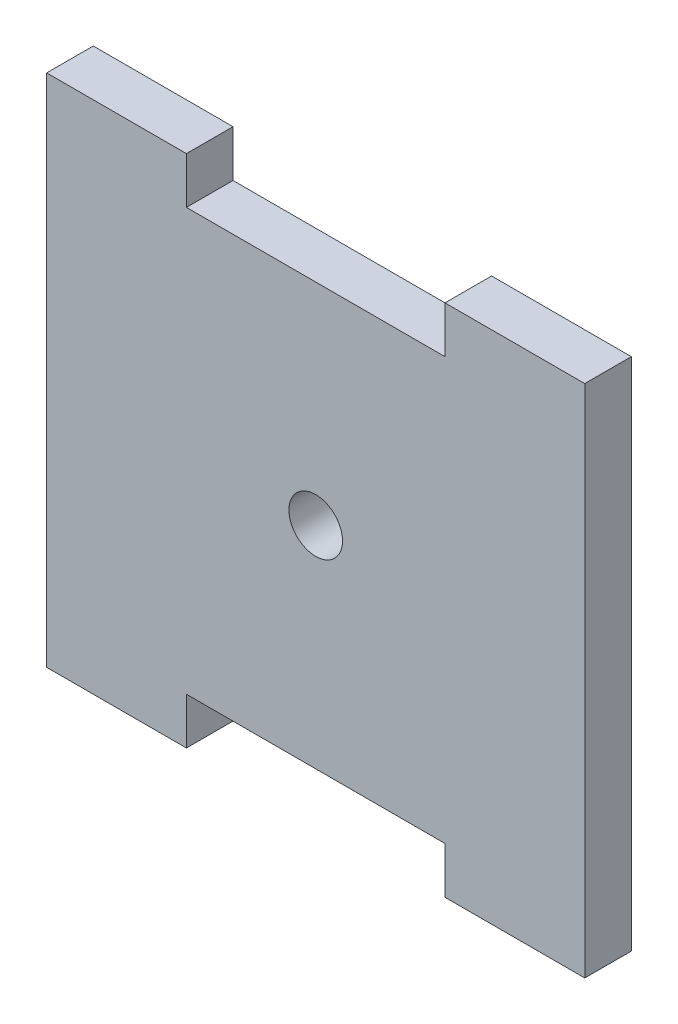
ISO-10303-21;
HEADER;
FILE_DESCRIPTION(('STEP AP214'),'2;1');
FILE_NAME('part.step','',(''),(''),'','','');
FILE_SCHEMA(('AUTOMOTIVE_DESIGN { 1 0 10303 214 1 1 1 1 }'));
ENDSEC;
DATA;
#1=APPLICATION_CONTEXT('core data for automotive mechanical design processes');
#2=APPLICATION_PROTOCOL_DEFINITION('international standard','automotive_design',2000,#1);
#3=PRODUCT_CONTEXT('',#1,'mechanical');
#4=PRODUCT('Part','Part','',(#3));
#5=PRODUCT_RELATED_PRODUCT_CATEGORY('part','',(#4));
#6=PRODUCT_DEFINITION_FORMATION('','',#4);
#7=PRODUCT_DEFINITION_CONTEXT('part definition',#1,'design');
#8=PRODUCT_DEFINITION('design','',#6,#7);
#9=PRODUCT_DEFINITION_SHAPE('','',#8);
#10=(LENGTH_UNIT() NAMED_UNIT(*) SI_UNIT(.MILLI.,.METRE.));
#11=(NAMED_UNIT(*) PLANE_ANGLE_UNIT() SI_UNIT($,.RADIAN.));
#12=(NAMED_UNIT(*) SI_UNIT($,.STERADIAN.) SOLID_ANGLE_UNIT());
#13=UNCERTAINTY_MEASURE_WITH_UNIT(LENGTH_MEASURE(1.E-05),#10,'distance_accuracy_value','');
#14=(GEOMETRIC_REPRESENTATION_CONTEXT(3) GLOBAL_UNCERTAINTY_ASSIGNED_CONTEXT((#13)) GLOBAL_UNIT_ASSIGNED_CONTEXT((#10,
#11,#12)) REPRESENTATION_CONTEXT('',''));
#15=CARTESIAN_POINT('',(0.,0.,0.));
#16=DIRECTION('',(0.,0.,1.));
#17=DIRECTION('',(1.,0.,0.));
#18=AXIS2_PLACEMENT_3D('',#15,#16,#17);
#19=CARTESIAN_POINT('',(3.,0.,2.));
#20=DIRECTION('',(-1.,0.,0.));
#21=DIRECTION('',(0.,0.,1.));
#22=AXIS2_PLACEMENT_3D('',#19,#20,#21);
#23=PLANE('',#22);
#24=DIRECTION('',(0.,1.,0.));
#25=VECTOR('',#24,1.);
#26=CARTESIAN_POINT('',(3.,0.,0.));
#27=LINE('',#26,#25);
#28=CARTESIAN_POINT('',(3.,-21.1,0.));
#29=VERTEX_POINT('',#28);
#30=CARTESIAN_POINT('',(3.,-19.1,0.));
#31=VERTEX_POINT('',#30);
#32=EDGE_CURVE('E161',#29,#31,#27,.T.);
#33=ORIENTED_EDGE('',*,*,#32,.T.);
#34=DIRECTION('',(0.,0.,-1.));
#35=VECTOR('',#34,1.);
#36=CARTESIAN_POINT('',(3.,-19.1,2.));
#37=LINE('',#36,#35);
#38=CARTESIAN_POINT('',(3.,-19.1,2.));
#39=VERTEX_POINT('',#38);
#40=EDGE_CURVE('E11',#39,#31,#37,.T.);
#41=ORIENTED_EDGE('',*,*,#40,.F.);
#42=DIRECTION('',(0.,1.,0.));
#43=VECTOR('',#42,1.);
#44=CARTESIAN_POINT('',(3.,0.,2.));
#45=LINE('',#44,#43);
#46=CARTESIAN_POINT('',(3.,-21.1,2.));
#47=VERTEX_POINT('',#46);
#48=EDGE_CURVE('E229',#47,#39,#45,.T.);
#49=ORIENTED_EDGE('',*,*,#48,.F.);
#50=DIRECTION('',(0.,0.,-1.));
#51=VECTOR('',#50,1.);
#52=CARTESIAN_POINT('',(3.,-21.1,2.));
#53=LINE('',#52,#51);
#54=EDGE_CURVE('E157',#47,#29,#53,.T.);
#55=ORIENTED_EDGE('',*,*,#54,.T.);
#56=EDGE_LOOP('',(#33,#41,#49,#55));
#57=FACE_BOUND('',#56,.T.);
#58=ADVANCED_FACE('F35',(#57),#23,.F.);
#59=CARTESIAN_POINT('',(0.,-19.1,2.));
#60=DIRECTION('',(0.,1.,0.));
#61=DIRECTION('',(0.,0.,1.));
#62=AXIS2_PLACEMENT_3D('',#59,#60,#61);
#63=PLANE('',#62);
#64=DIRECTION('',(1.,0.,0.));
#65=VECTOR('',#64,1.);
#66=CARTESIAN_POINT('',(0.,-19.1,0.));
#67=LINE('',#66,#65);
#68=CARTESIAN_POINT('',(14.1,-19.1,0.));
#69=VERTEX_POINT('',#68);
#70=EDGE_CURVE('E164',#31,#69,#67,.T.);
#71=ORIENTED_EDGE('',*,*,#70,.T.);
#72=DIRECTION('',(0.,0.,-1.));
#73=VECTOR('',#72,1.);
#74=CARTESIAN_POINT('',(14.1,-19.1,2.));
#75=LINE('',#74,#73);
#76=CARTESIAN_POINT('',(14.1,-19.1,2.));
#77=VERTEX_POINT('',#76);
#78=EDGE_CURVE('E44',#77,#69,#75,.T.);
#79=ORIENTED_EDGE('',*,*,#78,.F.);
#80=DIRECTION('',(1.,0.,0.));
#81=VECTOR('',#80,1.);
#82=CARTESIAN_POINT('',(0.,-19.1,2.));
#83=LINE('',#82,#81);
#84=EDGE_CURVE('E106',#39,#77,#83,.T.);
#85=ORIENTED_EDGE('',*,*,#84,.F.);
#86=ORIENTED_EDGE('',*,*,#40,.T.);
#87=EDGE_LOOP('',(#71,#79,#85,#86));
#88=FACE_BOUND('',#87,.T.);
#89=ADVANCED_FACE('F212',(#88),#63,.F.);
#90=CARTESIAN_POINT('',(14.1,0.,2.));
#91=DIRECTION('',(-1.,0.,0.));
#92=DIRECTION('',(0.,0.,1.));
#93=AXIS2_PLACEMENT_3D('',#90,#91,#92);
#94=PLANE('',#93);
#95=DIRECTION('',(0.,1.,0.));
#96=VECTOR('',#95,1.);
#97=CARTESIAN_POINT('',(14.1,0.,0.));
#98=LINE('',#97,#96);
#99=CARTESIAN_POINT('',(14.1,-21.1,0.));
#100=VERTEX_POINT('',#99);
#101=EDGE_CURVE('E167',#100,#69,#98,.T.);
#102=ORIENTED_EDGE('',*,*,#101,.F.);
#103=DIRECTION('',(0.,0.,-1.));
#104=VECTOR('',#103,1.);
#105=CARTESIAN_POINT('',(14.1,-21.1,2.));
#106=LINE('',#105,#104);
#107=CARTESIAN_POINT('',(14.1,-21.1,2.));
#108=VERTEX_POINT('',#107);
#109=EDGE_CURVE('E205',#108,#100,#106,.T.);
#110=ORIENTED_EDGE('',*,*,#109,.F.);
#111=DIRECTION('',(0.,1.,0.));
#112=VECTOR('',#111,1.);
#113=CARTESIAN_POINT('',(14.1,0.,2.));
#114=LINE('',#113,#112);
#115=EDGE_CURVE('E211',#108,#77,#114,.T.);
#116=ORIENTED_EDGE('',*,*,#115,.T.);
#117=ORIENTED_EDGE('',*,*,#78,.T.);
#118=EDGE_LOOP('',(#102,#110,#116,#117));
#119=FACE_BOUND('',#118,.T.);
#120=ADVANCED_FACE('F209',(#119),#94,.T.);
#121=CARTESIAN_POINT('',(0.,-21.1,2.));
#122=DIRECTION('',(0.,-1.,0.));
#123=DIRECTION('',(0.,0.,-1.));
#124=AXIS2_PLACEMENT_3D('',#121,#122,#123);
#125=PLANE('',#124);
#126=DIRECTION('',(-1.,0.,0.));
#127=VECTOR('',#126,1.);
#128=CARTESIAN_POINT('',(0.,-21.1,0.));
#129=LINE('',#128,#127);
#130=CARTESIAN_POINT('',(20.1,-21.1,0.));
#131=VERTEX_POINT('',#130);
#132=EDGE_CURVE('E170',#131,#100,#129,.T.);
#133=ORIENTED_EDGE('',*,*,#132,.F.);
#134=DIRECTION('',(0.,0.,-1.));
#135=VECTOR('',#134,1.);
#136=CARTESIAN_POINT('',(20.1,-21.1,2.));
#137=LINE('',#136,#135);
#138=CARTESIAN_POINT('',(20.1,-21.1,2.));
#139=VERTEX_POINT('',#138);
#140=EDGE_CURVE('E203',#139,#131,#137,.T.);
#141=ORIENTED_EDGE('',*,*,#140,.F.);
#142=DIRECTION('',(-1.,0.,0.));
#143=VECTOR('',#142,1.);
#144=CARTESIAN_POINT('',(0.,-21.1,2.));
#145=LINE('',#144,#143);
#146=EDGE_CURVE('E225',#139,#108,#145,.T.);
#147=ORIENTED_EDGE('',*,*,#146,.T.);
#148=ORIENTED_EDGE('',*,*,#109,.T.);
#149=EDGE_LOOP('',(#133,#141,#147,#148));
#150=FACE_BOUND('',#149,.T.);
#151=ADVANCED_FACE('F221',(#150),#125,.T.);
#152=CARTESIAN_POINT('',(20.1,0.,2.));
#153=DIRECTION('',(-1.,0.,0.));
#154=DIRECTION('',(0.,-1.,0.));
#155=AXIS2_PLACEMENT_3D('',#152,#153,#154);
#156=PLANE('',#155);
#157=DIRECTION('',(0.,1.,0.));
#158=VECTOR('',#157,1.);
#159=CARTESIAN_POINT('',(20.1,0.,0.));
#160=LINE('',#159,#158);
#161=CARTESIAN_POINT('',(20.1,0.999999999999999,0.));
#162=VERTEX_POINT('',#161);
#163=EDGE_CURVE('E173',#131,#162,#160,.T.);
#164=ORIENTED_EDGE('',*,*,#163,.T.);
#165=DIRECTION('',(0.,0.,-1.));
#166=VECTOR('',#165,1.);
#167=CARTESIAN_POINT('',(20.1,0.999999999999999,2.));
#168=LINE('',#167,#166);
#169=CARTESIAN_POINT('',(20.1,0.999999999999999,2.));
#170=VERTEX_POINT('',#169);
#171=EDGE_CURVE('E200',#170,#162,#168,.T.);
#172=ORIENTED_EDGE('',*,*,#171,.F.);
#173=DIRECTION('',(0.,1.,0.));
#174=VECTOR('',#173,1.);
#175=CARTESIAN_POINT('',(20.1,0.,2.));
#176=LINE('',#175,#174);
#177=EDGE_CURVE('E227',#139,#170,#176,.T.);
#178=ORIENTED_EDGE('',*,*,#177,.F.);
#179=ORIENTED_EDGE('',*,*,#140,.T.);
#180=EDGE_LOOP('',(#164,#172,#178,#179));
#181=FACE_BOUND('',#180,.T.);
#182=ADVANCED_FACE('F270',(#181),#156,.F.);
#183=CARTESIAN_POINT('',(0.,0.999999999999999,2.));
#184=DIRECTION('',(0.,-1.,0.));
#185=DIRECTION('',(0.,0.,-1.));
#186=AXIS2_PLACEMENT_3D('',#183,#184,#185);
#187=PLANE('',#186);
#188=DIRECTION('',(-1.,0.,0.));
#189=VECTOR('',#188,1.);
#190=CARTESIAN_POINT('',(0.,0.999999999999999,0.));
#191=LINE('',#190,#189);
#192=CARTESIAN_POINT('',(14.1,0.999999999999999,0.));
#193=VERTEX_POINT('',#192);
#194=EDGE_CURVE('E175',#162,#193,#191,.T.);
#195=ORIENTED_EDGE('',*,*,#194,.T.);
#196=DIRECTION('',(0.,0.,-1.));
#197=VECTOR('',#196,1.);
#198=CARTESIAN_POINT('',(14.1,0.999999999999999,2.));
#199=LINE('',#198,#197);
#200=CARTESIAN_POINT('',(14.1,0.999999999999999,2.));
#201=VERTEX_POINT('',#200);
#202=EDGE_CURVE('E197',#201,#193,#199,.T.);
#203=ORIENTED_EDGE('',*,*,#202,.F.);
#204=DIRECTION('',(-1.,0.,0.));
#205=VECTOR('',#204,1.);
#206=CARTESIAN_POINT('',(0.,0.999999999999999,2.));
#207=LINE('',#206,#205);
#208=EDGE_CURVE('E234',#170,#201,#207,.T.);
#209=ORIENTED_EDGE('',*,*,#208,.F.);
#210=ORIENTED_EDGE('',*,*,#171,.T.);
#211=EDGE_LOOP('',(#195,#203,#209,#210));
#212=FACE_BOUND('',#211,.T.);
#213=ADVANCED_FACE('F273',(#212),#187,.F.);
#214=CARTESIAN_POINT('',(14.1,0.,2.));
#215=DIRECTION('',(1.,0.,0.));
#216=DIRECTION('',(0.,0.,-1.));
#217=AXIS2_PLACEMENT_3D('',#214,#215,#216);
#218=PLANE('',#217);
#219=DIRECTION('',(0.,-1.,0.));
#220=VECTOR('',#219,1.);
#221=CARTESIAN_POINT('',(14.1,0.,0.));
#222=LINE('',#221,#220);
#223=CARTESIAN_POINT('',(14.1,-1.,0.));
#224=VERTEX_POINT('',#223);
#225=EDGE_CURVE('E177',#193,#224,#222,.T.);
#226=ORIENTED_EDGE('',*,*,#225,.T.);
#227=DIRECTION('',(0.,0.,-1.));
#228=VECTOR('',#227,1.);
#229=CARTESIAN_POINT('',(14.1,-1.,2.));
#230=LINE('',#229,#228);
#231=CARTESIAN_POINT('',(14.1,-1.,2.));
#232=VERTEX_POINT('',#231);
#233=EDGE_CURVE('E195',#232,#224,#230,.T.);
#234=ORIENTED_EDGE('',*,*,#233,.F.);
#235=DIRECTION('',(0.,-1.,0.));
#236=VECTOR('',#235,1.);
#237=CARTESIAN_POINT('',(14.1,0.,2.));
#238=LINE('',#237,#236);
#239=EDGE_CURVE('E236',#201,#232,#238,.T.);
#240=ORIENTED_EDGE('',*,*,#239,.F.);
#241=ORIENTED_EDGE('',*,*,#202,.T.);
#242=EDGE_LOOP('',(#226,#234,#240,#241));
#243=FACE_BOUND('',#242,.T.);
#244=ADVANCED_FACE('F277',(#243),#218,.F.);
#245=CARTESIAN_POINT('',(0.,-1.,2.));
#246=DIRECTION('',(0.,1.,0.));
#247=DIRECTION('',(0.,0.,1.));
#248=AXIS2_PLACEMENT_3D('',#245,#246,#247);
#249=PLANE('',#248);
#250=DIRECTION('',(1.,0.,0.));
#251=VECTOR('',#250,1.);
#252=CARTESIAN_POINT('',(0.,-1.,0.));
#253=LINE('',#252,#251);
#254=CARTESIAN_POINT('',(3.,-1.,0.));
#255=VERTEX_POINT('',#254);
#256=EDGE_CURVE('E180',#255,#224,#253,.T.);
#257=ORIENTED_EDGE('',*,*,#256,.F.);
#258=DIRECTION('',(0.,0.,-1.));
#259=VECTOR('',#258,1.);
#260=CARTESIAN_POINT('',(3.,-1.,2.));
#261=LINE('',#260,#259);
#262=CARTESIAN_POINT('',(3.,-1.,2.));
#263=VERTEX_POINT('',#262);
#264=EDGE_CURVE('E193',#263,#255,#261,.T.);
#265=ORIENTED_EDGE('',*,*,#264,.F.);
#266=DIRECTION('',(1.,0.,0.));
#267=VECTOR('',#266,1.);
#268=CARTESIAN_POINT('',(0.,-1.,2.));
#269=LINE('',#268,#267);
#270=EDGE_CURVE('E152',#263,#232,#269,.T.);
#271=ORIENTED_EDGE('',*,*,#270,.T.);
#272=ORIENTED_EDGE('',*,*,#233,.T.);
#273=EDGE_LOOP('',(#257,#265,#271,#272));
#274=FACE_BOUND('',#273,.T.);
#275=ADVANCED_FACE('F240',(#274),#249,.T.);
#276=CARTESIAN_POINT('',(3.,0.,2.));
#277=DIRECTION('',(1.,0.,0.));
#278=DIRECTION('',(0.,1.,0.));
#279=AXIS2_PLACEMENT_3D('',#276,#277,#278);
#280=PLANE('',#279);
#281=DIRECTION('',(0.,-1.,0.));
#282=VECTOR('',#281,1.);
#283=CARTESIAN_POINT('',(3.,0.,0.));
#284=LINE('',#283,#282);
#285=CARTESIAN_POINT('',(3.,0.999999999999999,0.));
#286=VERTEX_POINT('',#285);
#287=EDGE_CURVE('E183',#286,#255,#284,.T.);
#288=ORIENTED_EDGE('',*,*,#287,.F.);
#289=DIRECTION('',(0.,0.,-1.));
#290=VECTOR('',#289,1.);
#291=CARTESIAN_POINT('',(3.,0.999999999999999,2.));
#292=LINE('',#291,#290);
#293=CARTESIAN_POINT('',(3.,0.999999999999999,2.));
#294=VERTEX_POINT('',#293);
#295=EDGE_CURVE('E140',#294,#286,#292,.T.);
#296=ORIENTED_EDGE('',*,*,#295,.F.);
#297=DIRECTION('',(0.,-1.,0.));
#298=VECTOR('',#297,1.);
#299=CARTESIAN_POINT('',(3.,0.,2.));
#300=LINE('',#299,#298);
#301=EDGE_CURVE('E150',#294,#263,#300,.T.);
#302=ORIENTED_EDGE('',*,*,#301,.T.);
#303=ORIENTED_EDGE('',*,*,#264,.T.);
#304=EDGE_LOOP('',(#288,#296,#302,#303));
#305=FACE_BOUND('',#304,.T.);
#306=ADVANCED_FACE('F245',(#305),#280,.T.);
#307=CARTESIAN_POINT('',(0.,0.999999999999999,2.));
#308=DIRECTION('',(0.,1.,0.));
#309=DIRECTION('',(0.,0.,1.));
#310=AXIS2_PLACEMENT_3D('',#307,#308,#309);
#311=PLANE('',#310);
#312=DIRECTION('',(1.,0.,0.));
#313=VECTOR('',#312,1.);
#314=CARTESIAN_POINT('',(0.,0.999999999999999,0.));
#315=LINE('',#314,#313);
#316=CARTESIAN_POINT('',(-3.,0.999999999999999,0.));
#317=VERTEX_POINT('',#316);
#318=EDGE_CURVE('E139',#317,#286,#315,.T.);
#319=ORIENTED_EDGE('',*,*,#318,.F.);
#320=DIRECTION('',(0.,0.,-1.));
#321=VECTOR('',#320,1.);
#322=CARTESIAN_POINT('',(-3.,0.999999999999999,2.));
#323=LINE('',#322,#321);
#324=CARTESIAN_POINT('',(-3.,0.999999999999999,2.));
#325=VERTEX_POINT('',#324);
#326=EDGE_CURVE('E133',#325,#317,#323,.T.);
#327=ORIENTED_EDGE('',*,*,#326,.F.);
#328=DIRECTION('',(1.,0.,0.));
#329=VECTOR('',#328,1.);
#330=CARTESIAN_POINT('',(0.,0.999999999999999,2.));
#331=LINE('',#330,#329);
#332=EDGE_CURVE('E137',#325,#294,#331,.T.);
#333=ORIENTED_EDGE('',*,*,#332,.T.);
#334=ORIENTED_EDGE('',*,*,#295,.T.);
#335=EDGE_LOOP('',(#319,#327,#333,#334));
#336=FACE_BOUND('',#335,.T.);
#337=ADVANCED_FACE('F135',(#336),#311,.T.);
#338=CARTESIAN_POINT('',(-3.,0.,2.));
#339=DIRECTION('',(1.,0.,0.));
#340=DIRECTION('',(0.,0.,-1.));
#341=AXIS2_PLACEMENT_3D('',#338,#339,#340);
#342=PLANE('',#341);
#343=DIRECTION('',(0.,-1.,0.));
#344=VECTOR('',#343,1.);
#345=CARTESIAN_POINT('',(-3.,0.,0.));
#346=LINE('',#345,#344);
#347=CARTESIAN_POINT('',(-3.,-21.1,0.));
#348=VERTEX_POINT('',#347);
#349=EDGE_CURVE('E92',#317,#348,#346,.T.);
#350=ORIENTED_EDGE('',*,*,#349,.T.);
#351=DIRECTION('',(0.,0.,-1.));
#352=VECTOR('',#351,1.);
#353=CARTESIAN_POINT('',(-3.,-21.1,2.));
#354=LINE('',#353,#352);
#355=CARTESIAN_POINT('',(-3.,-21.1,2.));
#356=VERTEX_POINT('',#355);
#357=EDGE_CURVE('E141',#356,#348,#354,.T.);
#358=ORIENTED_EDGE('',*,*,#357,.F.);
#359=DIRECTION('',(0.,-1.,0.));
#360=VECTOR('',#359,1.);
#361=CARTESIAN_POINT('',(-3.,0.,2.));
#362=LINE('',#361,#360);
#363=EDGE_CURVE('E143',#325,#356,#362,.T.);
#364=ORIENTED_EDGE('',*,*,#363,.F.);
#365=ORIENTED_EDGE('',*,*,#326,.T.);
#366=EDGE_LOOP('',(#350,#358,#364,#365));
#367=FACE_BOUND('',#366,.T.);
#368=ADVANCED_FACE('F144',(#367),#342,.F.);
#369=CARTESIAN_POINT('',(8.55,-10.05,2.));
#370=DIRECTION('',(0.,0.,-1.));
#371=DIRECTION('',(-1.,0.,0.));
#372=AXIS2_PLACEMENT_3D('',#369,#370,#371);
#373=CYLINDRICAL_SURFACE('',#372,1.15);
#374=CARTESIAN_POINT('',(8.55,-10.05,2.));
#375=DIRECTION('',(0.,0.,1.));
#376=DIRECTION('',(1.,0.,0.));
#377=AXIS2_PLACEMENT_3D('',#374,#375,#376);
#378=CIRCLE('',#377,1.15);
#379=CARTESIAN_POINT('',(9.7,-10.05,2.));
#380=VERTEX_POINT('',#379);
#381=EDGE_CURVE('E189',#380,#380,#378,.T.);
#382=ORIENTED_EDGE('',*,*,#381,.T.);
#383=EDGE_LOOP('',(#382));
#384=FACE_BOUND('',#383,.T.);
#385=CARTESIAN_POINT('',(8.55,-10.05,0.));
#386=DIRECTION('',(0.,0.,1.));
#387=DIRECTION('',(1.,0.,0.));
#388=AXIS2_PLACEMENT_3D('',#385,#386,#387);
#389=CIRCLE('',#388,1.15);
#390=CARTESIAN_POINT('',(9.7,-10.05,0.));
#391=VERTEX_POINT('',#390);
#392=EDGE_CURVE('E158',#391,#391,#389,.T.);
#393=ORIENTED_EDGE('',*,*,#392,.F.);
#394=EDGE_LOOP('',(#393));
#395=FACE_BOUND('',#394,.T.);
#396=ADVANCED_FACE('F37',(#384,#395),#373,.F.);
#397=CARTESIAN_POINT('',(0.,-21.1,2.));
#398=DIRECTION('',(0.,1.,0.));
#399=DIRECTION('',(0.,0.,1.));
#400=AXIS2_PLACEMENT_3D('',#397,#398,#399);
#401=PLANE('',#400);
#402=DIRECTION('',(1.,0.,0.));
#403=VECTOR('',#402,1.);
#404=CARTESIAN_POINT('',(0.,-21.1,0.));
#405=LINE('',#404,#403);
#406=EDGE_CURVE('E98',#348,#29,#405,.T.);
#407=ORIENTED_EDGE('',*,*,#406,.T.);
#408=ORIENTED_EDGE('',*,*,#54,.F.);
#409=DIRECTION('',(1.,0.,0.));
#410=VECTOR('',#409,1.);
#411=CARTESIAN_POINT('',(0.,-21.1,2.));
#412=LINE('',#411,#410);
#413=EDGE_CURVE('E52',#356,#47,#412,.T.);
#414=ORIENTED_EDGE('',*,*,#413,.F.);
#415=ORIENTED_EDGE('',*,*,#357,.T.);
#416=EDGE_LOOP('',(#407,#408,#414,#415));
#417=FACE_BOUND('',#416,.T.);
#418=ADVANCED_FACE('F248',(#417),#401,.F.);
#419=CARTESIAN_POINT('',(0.,0.,2.));
#420=DIRECTION('',(0.,0.,1.));
#421=DIRECTION('',(1.,0.,0.));
#422=AXIS2_PLACEMENT_3D('',#419,#420,#421);
#423=PLANE('',#422);
#424=ORIENTED_EDGE('',*,*,#381,.F.);
#425=EDGE_LOOP('',(#424));
#426=FACE_BOUND('',#425,.T.);
#427=ORIENTED_EDGE('',*,*,#48,.T.);
#428=ORIENTED_EDGE('',*,*,#84,.T.);
#429=ORIENTED_EDGE('',*,*,#115,.F.);
#430=ORIENTED_EDGE('',*,*,#146,.F.);
#431=ORIENTED_EDGE('',*,*,#177,.T.);
#432=ORIENTED_EDGE('',*,*,#208,.T.);
#433=ORIENTED_EDGE('',*,*,#239,.T.);
#434=ORIENTED_EDGE('',*,*,#270,.F.);
#435=ORIENTED_EDGE('',*,*,#301,.F.);
#436=ORIENTED_EDGE('',*,*,#332,.F.);
#437=ORIENTED_EDGE('',*,*,#363,.T.);
#438=ORIENTED_EDGE('',*,*,#413,.T.);
#439=EDGE_LOOP('',(#427,#428,#429,#430,#431,#432,#433,#434,#435,#436,#437,#438));
#440=FACE_BOUND('',#439,.T.);
#441=ADVANCED_FACE('F147',(#426,#440),#423,.T.);
#442=CARTESIAN_POINT('',(0.,0.,0.));
#443=DIRECTION('',(0.,0.,1.));
#444=DIRECTION('',(1.,0.,0.));
#445=AXIS2_PLACEMENT_3D('',#442,#443,#444);
#446=PLANE('',#445);
#447=ORIENTED_EDGE('',*,*,#392,.T.);
#448=EDGE_LOOP('',(#447));
#449=FACE_BOUND('',#448,.T.);
#450=ORIENTED_EDGE('',*,*,#32,.F.);
#451=ORIENTED_EDGE('',*,*,#406,.F.);
#452=ORIENTED_EDGE('',*,*,#349,.F.);
#453=ORIENTED_EDGE('',*,*,#318,.T.);
#454=ORIENTED_EDGE('',*,*,#287,.T.);
#455=ORIENTED_EDGE('',*,*,#256,.T.);
#456=ORIENTED_EDGE('',*,*,#225,.F.);
#457=ORIENTED_EDGE('',*,*,#194,.F.);
#458=ORIENTED_EDGE('',*,*,#163,.F.);
#459=ORIENTED_EDGE('',*,*,#132,.T.);
#460=ORIENTED_EDGE('',*,*,#101,.T.);
#461=ORIENTED_EDGE('',*,*,#70,.F.);
#462=EDGE_LOOP('',(#450,#451,#452,#453,#454,#455,#456,#457,#458,#459,#460,#461));
#463=FACE_BOUND('',#462,.T.);
#464=ADVANCED_FACE('F216',(#449,#463),#446,.F.);
#465=CLOSED_SHELL('',(#58,#89,#120,#151,#182,#213,#244,#275,#306,#337,#368,#396,#418,#441,#464));
#466=MANIFOLD_SOLID_BREP('B2',#465);
#467=ADVANCED_BREP_SHAPE_REPRESENTATION('',(#18,#466),#14);
#468=SHAPE_DEFINITION_REPRESENTATION(#9,#467);
ENDSEC;
END-ISO-10303-21;
